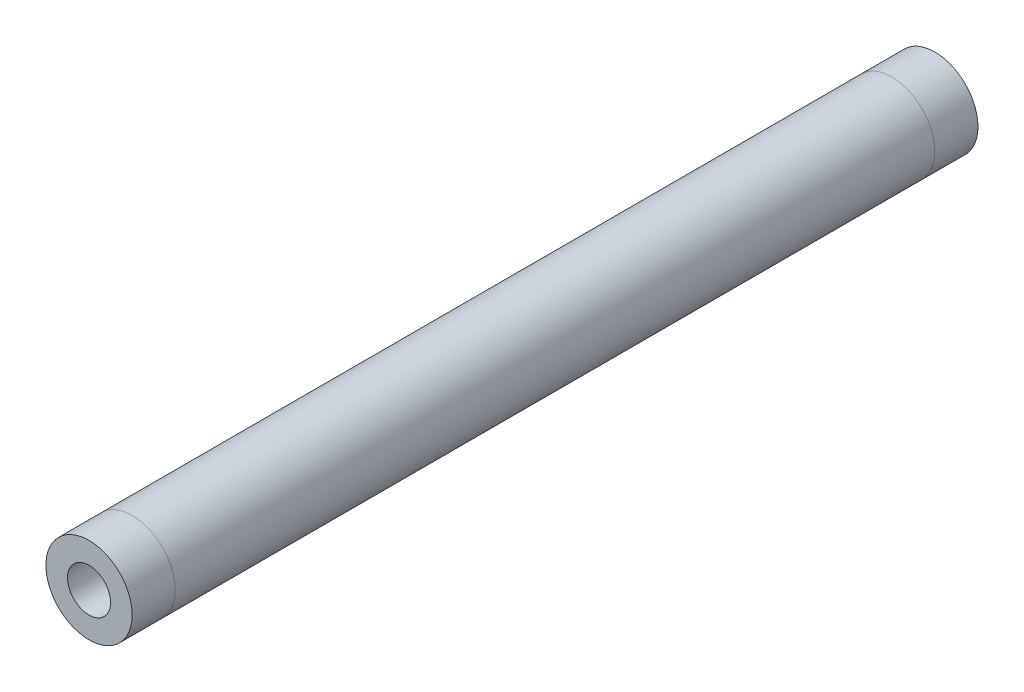
ISO-10303-21;
HEADER;
FILE_DESCRIPTION(('STEP AP214'),'2;1');
FILE_NAME('part.step','',(''),(''),'','','');
FILE_SCHEMA(('AUTOMOTIVE_DESIGN { 1 0 10303 214 1 1 1 1 }'));
ENDSEC;
DATA;
#1=APPLICATION_CONTEXT('core data for automotive mechanical design processes');
#2=APPLICATION_PROTOCOL_DEFINITION('international standard','automotive_design',2000,#1);
#3=PRODUCT_CONTEXT('',#1,'mechanical');
#4=PRODUCT('Part','Part','',(#3));
#5=PRODUCT_RELATED_PRODUCT_CATEGORY('part','',(#4));
#6=PRODUCT_DEFINITION_FORMATION('','',#4);
#7=PRODUCT_DEFINITION_CONTEXT('part definition',#1,'design');
#8=PRODUCT_DEFINITION('design','',#6,#7);
#9=PRODUCT_DEFINITION_SHAPE('','',#8);
#10=(LENGTH_UNIT() NAMED_UNIT(*) SI_UNIT(.MILLI.,.METRE.));
#11=(NAMED_UNIT(*) PLANE_ANGLE_UNIT() SI_UNIT($,.RADIAN.));
#12=(NAMED_UNIT(*) SI_UNIT($,.STERADIAN.) SOLID_ANGLE_UNIT());
#13=UNCERTAINTY_MEASURE_WITH_UNIT(LENGTH_MEASURE(1.E-05),#10,'distance_accuracy_value','');
#14=(GEOMETRIC_REPRESENTATION_CONTEXT(3) GLOBAL_UNCERTAINTY_ASSIGNED_CONTEXT((#13)) GLOBAL_UNIT_ASSIGNED_CONTEXT((#10,
#11,#12)) REPRESENTATION_CONTEXT('',''));
#15=CARTESIAN_POINT('',(0.,0.,0.));
#16=DIRECTION('',(0.,0.,1.));
#17=DIRECTION('',(1.,0.,0.));
#18=AXIS2_PLACEMENT_3D('',#15,#16,#17);
#19=CARTESIAN_POINT('',(0.,0.,-158.111565442138));
#20=DIRECTION('',(0.,0.,1.));
#21=DIRECTION('',(1.,0.,0.));
#22=AXIS2_PLACEMENT_3D('',#19,#20,#21);
#23=CYLINDRICAL_SURFACE('',#22,6.35);
#24=CARTESIAN_POINT('',(0.,0.,-140.1510532));
#25=DIRECTION('',(0.,0.,1.));
#26=DIRECTION('',(1.,0.,0.));
#27=AXIS2_PLACEMENT_3D('',#24,#25,#26);
#28=CIRCLE('',#27,6.35);
#29=CARTESIAN_POINT('',(6.35,0.,-140.1510532));
#30=VERTEX_POINT('',#29);
#31=EDGE_CURVE('E12',#30,#30,#28,.F.);
#32=ORIENTED_EDGE('',*,*,#31,.F.);
#33=EDGE_LOOP('',(#32));
#34=FACE_BOUND('',#33,.T.);
#35=CARTESIAN_POINT('',(0.,0.,-28.2575));
#36=DIRECTION('',(0.,0.,1.));
#37=DIRECTION('',(1.,0.,0.));
#38=AXIS2_PLACEMENT_3D('',#35,#36,#37);
#39=CIRCLE('',#38,6.35);
#40=CARTESIAN_POINT('',(6.35,0.,-28.2575));
#41=VERTEX_POINT('',#40);
#42=EDGE_CURVE('E79',#41,#41,#39,.T.);
#43=ORIENTED_EDGE('',*,*,#42,.F.);
#44=EDGE_LOOP('',(#43));
#45=FACE_BOUND('',#44,.T.);
#46=ADVANCED_FACE('F68',(#34,#45),#23,.T.);
#47=CARTESIAN_POINT('',(0.,0.,-28.2575));
#48=DIRECTION('',(0.,0.,1.));
#49=DIRECTION('',(1.,0.,0.));
#50=AXIS2_PLACEMENT_3D('',#47,#48,#49);
#51=PLANE('',#50);
#52=CARTESIAN_POINT('',(0.,0.,-28.2575));
#53=DIRECTION('',(0.,0.,1.));
#54=DIRECTION('',(1.,0.,0.));
#55=AXIS2_PLACEMENT_3D('',#52,#53,#54);
#56=CIRCLE('',#55,4.7625);
#57=CARTESIAN_POINT('',(4.7625,0.,-28.2575));
#58=VERTEX_POINT('',#57);
#59=EDGE_CURVE('E81',#58,#58,#56,.T.);
#60=ORIENTED_EDGE('',*,*,#59,.F.);
#61=EDGE_LOOP('',(#60));
#62=FACE_BOUND('',#61,.T.);
#63=ORIENTED_EDGE('',*,*,#42,.T.);
#64=EDGE_LOOP('',(#63));
#65=FACE_BOUND('',#64,.T.);
#66=ADVANCED_FACE('F86',(#62,#65),#51,.T.);
#67=CARTESIAN_POINT('',(0.,0.,-158.111565442138));
#68=DIRECTION('',(0.,0.,1.));
#69=DIRECTION('',(1.,0.,0.));
#70=AXIS2_PLACEMENT_3D('',#67,#68,#69);
#71=CYLINDRICAL_SURFACE('',#70,4.7625);
#72=CARTESIAN_POINT('',(0.,0.,-140.1510532));
#73=DIRECTION('',(0.,0.,1.));
#74=DIRECTION('',(1.,0.,0.));
#75=AXIS2_PLACEMENT_3D('',#72,#73,#74);
#76=CIRCLE('',#75,4.7625);
#77=CARTESIAN_POINT('',(4.7625,0.,-140.1510532));
#78=VERTEX_POINT('',#77);
#79=EDGE_CURVE('E71',#78,#78,#76,.F.);
#80=ORIENTED_EDGE('',*,*,#79,.T.);
#81=EDGE_LOOP('',(#80));
#82=FACE_BOUND('',#81,.T.);
#83=ORIENTED_EDGE('',*,*,#59,.T.);
#84=EDGE_LOOP('',(#83));
#85=FACE_BOUND('',#84,.T.);
#86=ADVANCED_FACE('F93',(#82,#85),#71,.F.);
#87=CARTESIAN_POINT('',(0.,0.,-140.1510532));
#88=DIRECTION('',(0.,0.,1.));
#89=DIRECTION('',(1.,0.,0.));
#90=AXIS2_PLACEMENT_3D('',#87,#88,#89);
#91=PLANE('',#90);
#92=ORIENTED_EDGE('',*,*,#31,.T.);
#93=EDGE_LOOP('',(#92));
#94=FACE_BOUND('',#93,.T.);
#95=ORIENTED_EDGE('',*,*,#79,.F.);
#96=EDGE_LOOP('',(#95));
#97=FACE_BOUND('',#96,.T.);
#98=ADVANCED_FACE('F98',(#94,#97),#91,.F.);
#99=CLOSED_SHELL('',(#46,#66,#86,#98));
#100=MANIFOLD_SOLID_BREP('B2',#99);
#101=CARTESIAN_POINT('',(0.,0.,-140.1510532));
#102=DIRECTION('',(0.,0.,1.));
#103=DIRECTION('',(1.,0.,0.));
#104=AXIS2_PLACEMENT_3D('',#101,#102,#103);
#105=PLANE('',#104);
#106=CARTESIAN_POINT('',(0.,0.,-140.1510532));
#107=DIRECTION('',(0.,0.,1.));
#108=DIRECTION('',(1.,0.,0.));
#109=AXIS2_PLACEMENT_3D('',#106,#107,#108);
#110=CIRCLE('',#109,6.35);
#111=CARTESIAN_POINT('',(6.35,0.,-140.1510532));
#112=VERTEX_POINT('',#111);
#113=EDGE_CURVE('E67',#112,#112,#110,.T.);
#114=ORIENTED_EDGE('',*,*,#113,.T.);
#115=EDGE_LOOP('',(#114));
#116=FACE_BOUND('',#115,.T.);
#117=CARTESIAN_POINT('',(0.,0.,-140.1510532));
#118=DIRECTION('',(0.,0.,1.));
#119=DIRECTION('',(1.,0.,0.));
#120=AXIS2_PLACEMENT_3D('',#117,#118,#119);
#121=CIRCLE('',#120,4.7625);
#122=CARTESIAN_POINT('',(4.7625,0.,-140.1510532));
#123=VERTEX_POINT('',#122);
#124=EDGE_CURVE('E151',#123,#123,#121,.T.);
#125=ORIENTED_EDGE('',*,*,#124,.F.);
#126=EDGE_LOOP('',(#125));
#127=FACE_BOUND('',#126,.T.);
#128=ADVANCED_FACE('F137',(#116,#127),#105,.T.);
#129=CARTESIAN_POINT('',(0.,0.,-140.1510532));
#130=DIRECTION('',(0.,0.,-1.));
#131=DIRECTION('',(-1.,0.,0.));
#132=AXIS2_PLACEMENT_3D('',#129,#130,#131);
#133=CYLINDRICAL_SURFACE('',#132,6.35);
#134=ORIENTED_EDGE('',*,*,#113,.F.);
#135=EDGE_LOOP('',(#134));
#136=FACE_BOUND('',#135,.T.);
#137=CARTESIAN_POINT('',(0.,0.,-146.5010532));
#138=DIRECTION('',(0.,0.,1.));
#139=DIRECTION('',(1.,0.,0.));
#140=AXIS2_PLACEMENT_3D('',#137,#138,#139);
#141=CIRCLE('',#140,6.35);
#142=CARTESIAN_POINT('',(6.35,0.,-146.5010532));
#143=VERTEX_POINT('',#142);
#144=EDGE_CURVE('E149',#143,#143,#141,.T.);
#145=ORIENTED_EDGE('',*,*,#144,.T.);
#146=EDGE_LOOP('',(#145));
#147=FACE_BOUND('',#146,.T.);
#148=ADVANCED_FACE('F139',(#136,#147),#133,.T.);
#149=CARTESIAN_POINT('',(0.,0.,-140.1510532));
#150=DIRECTION('',(0.,0.,-1.));
#151=DIRECTION('',(-1.,0.,0.));
#152=AXIS2_PLACEMENT_3D('',#149,#150,#151);
#153=CYLINDRICAL_SURFACE('',#152,3.175);
#154=CARTESIAN_POINT('',(0.,0.,-146.5010532));
#155=DIRECTION('',(0.,0.,1.));
#156=DIRECTION('',(1.,0.,0.));
#157=AXIS2_PLACEMENT_3D('',#154,#155,#156);
#158=CIRCLE('',#157,3.175);
#159=CARTESIAN_POINT('',(3.175,0.,-146.5010532));
#160=VERTEX_POINT('',#159);
#161=EDGE_CURVE('E141',#160,#160,#158,.T.);
#162=ORIENTED_EDGE('',*,*,#161,.F.);
#163=EDGE_LOOP('',(#162));
#164=FACE_BOUND('',#163,.T.);
#165=CARTESIAN_POINT('',(0.,0.,-133.8010532));
#166=DIRECTION('',(0.,0.,1.));
#167=DIRECTION('',(1.,0.,0.));
#168=AXIS2_PLACEMENT_3D('',#165,#166,#167);
#169=CIRCLE('',#168,3.175);
#170=CARTESIAN_POINT('',(3.175,0.,-133.8010532));
#171=VERTEX_POINT('',#170);
#172=EDGE_CURVE('E161',#171,#171,#169,.T.);
#173=ORIENTED_EDGE('',*,*,#172,.T.);
#174=EDGE_LOOP('',(#173));
#175=FACE_BOUND('',#174,.T.);
#176=ADVANCED_FACE('F166',(#164,#175),#153,.F.);
#177=CARTESIAN_POINT('',(0.,0.,-146.5010532));
#178=DIRECTION('',(0.,0.,1.));
#179=DIRECTION('',(1.,0.,0.));
#180=AXIS2_PLACEMENT_3D('',#177,#178,#179);
#181=PLANE('',#180);
#182=ORIENTED_EDGE('',*,*,#144,.F.);
#183=EDGE_LOOP('',(#182));
#184=FACE_BOUND('',#183,.T.);
#185=ORIENTED_EDGE('',*,*,#161,.T.);
#186=EDGE_LOOP('',(#185));
#187=FACE_BOUND('',#186,.T.);
#188=ADVANCED_FACE('F171',(#184,#187),#181,.F.);
#189=CARTESIAN_POINT('',(0.,0.,-133.8010532));
#190=DIRECTION('',(0.,0.,1.));
#191=DIRECTION('',(1.,0.,0.));
#192=AXIS2_PLACEMENT_3D('',#189,#190,#191);
#193=PLANE('',#192);
#194=CARTESIAN_POINT('',(0.,0.,-133.8010532));
#195=DIRECTION('',(0.,0.,1.));
#196=DIRECTION('',(1.,0.,0.));
#197=AXIS2_PLACEMENT_3D('',#194,#195,#196);
#198=CIRCLE('',#197,4.7625);
#199=CARTESIAN_POINT('',(4.7625,0.,-133.8010532));
#200=VERTEX_POINT('',#199);
#201=EDGE_CURVE('E154',#200,#200,#198,.T.);
#202=ORIENTED_EDGE('',*,*,#201,.T.);
#203=EDGE_LOOP('',(#202));
#204=FACE_BOUND('',#203,.T.);
#205=ORIENTED_EDGE('',*,*,#172,.F.);
#206=EDGE_LOOP('',(#205));
#207=FACE_BOUND('',#206,.T.);
#208=ADVANCED_FACE('F168',(#204,#207),#193,.T.);
#209=CARTESIAN_POINT('',(0.,0.,-133.8010532));
#210=DIRECTION('',(0.,0.,-1.));
#211=DIRECTION('',(-1.,0.,0.));
#212=AXIS2_PLACEMENT_3D('',#209,#210,#211);
#213=CYLINDRICAL_SURFACE('',#212,4.7625);
#214=ORIENTED_EDGE('',*,*,#201,.F.);
#215=EDGE_LOOP('',(#214));
#216=FACE_BOUND('',#215,.T.);
#217=ORIENTED_EDGE('',*,*,#124,.T.);
#218=EDGE_LOOP('',(#217));
#219=FACE_BOUND('',#218,.T.);
#220=ADVANCED_FACE('F170',(#216,#219),#213,.T.);
#221=CLOSED_SHELL('',(#128,#148,#176,#188,#208,#220));
#222=MANIFOLD_SOLID_BREP('B7',#221);
#223=CARTESIAN_POINT('',(0.,0.,-28.2575));
#224=DIRECTION('',(0.,0.,1.));
#225=DIRECTION('',(1.,0.,0.));
#226=AXIS2_PLACEMENT_3D('',#223,#224,#225);
#227=CYLINDRICAL_SURFACE('',#226,6.35);
#228=CARTESIAN_POINT('',(0.,0.,-28.2575));
#229=DIRECTION('',(0.,0.,1.));
#230=DIRECTION('',(1.,0.,0.));
#231=AXIS2_PLACEMENT_3D('',#228,#229,#230);
#232=CIRCLE('',#231,6.35);
#233=CARTESIAN_POINT('',(6.35,0.,-28.2575));
#234=VERTEX_POINT('',#233);
#235=EDGE_CURVE('E136',#234,#234,#232,.T.);
#236=ORIENTED_EDGE('',*,*,#235,.T.);
#237=EDGE_LOOP('',(#236));
#238=FACE_BOUND('',#237,.T.);
#239=CARTESIAN_POINT('',(0.,0.,-21.9075));
#240=DIRECTION('',(0.,0.,1.));
#241=DIRECTION('',(1.,0.,0.));
#242=AXIS2_PLACEMENT_3D('',#239,#240,#241);
#243=CIRCLE('',#242,6.35);
#244=CARTESIAN_POINT('',(6.35,0.,-21.9075));
#245=VERTEX_POINT('',#244);
#246=EDGE_CURVE('E249',#245,#245,#243,.T.);
#247=ORIENTED_EDGE('',*,*,#246,.F.);
#248=EDGE_LOOP('',(#247));
#249=FACE_BOUND('',#248,.T.);
#250=ADVANCED_FACE('F238',(#238,#249),#227,.T.);
#251=CARTESIAN_POINT('',(0.,0.,-28.2575));
#252=DIRECTION('',(0.,0.,1.));
#253=DIRECTION('',(1.,0.,0.));
#254=AXIS2_PLACEMENT_3D('',#251,#252,#253);
#255=CYLINDRICAL_SURFACE('',#254,3.175);
#256=CARTESIAN_POINT('',(0.,0.,-21.9075));
#257=DIRECTION('',(0.,0.,1.));
#258=DIRECTION('',(1.,0.,0.));
#259=AXIS2_PLACEMENT_3D('',#256,#257,#258);
#260=CIRCLE('',#259,3.175);
#261=CARTESIAN_POINT('',(3.175,0.,-21.9075));
#262=VERTEX_POINT('',#261);
#263=EDGE_CURVE('E241',#262,#262,#260,.T.);
#264=ORIENTED_EDGE('',*,*,#263,.T.);
#265=EDGE_LOOP('',(#264));
#266=FACE_BOUND('',#265,.T.);
#267=CARTESIAN_POINT('',(0.,0.,-34.6075));
#268=DIRECTION('',(0.,0.,1.));
#269=DIRECTION('',(1.,0.,0.));
#270=AXIS2_PLACEMENT_3D('',#267,#268,#269);
#271=CIRCLE('',#270,3.175);
#272=CARTESIAN_POINT('',(3.175,0.,-34.6075));
#273=VERTEX_POINT('',#272);
#274=EDGE_CURVE('E261',#273,#273,#271,.T.);
#275=ORIENTED_EDGE('',*,*,#274,.F.);
#276=EDGE_LOOP('',(#275));
#277=FACE_BOUND('',#276,.T.);
#278=ADVANCED_FACE('F269',(#266,#277),#255,.F.);
#279=CARTESIAN_POINT('',(0.,0.,-28.2575));
#280=DIRECTION('',(0.,0.,1.));
#281=DIRECTION('',(1.,0.,0.));
#282=AXIS2_PLACEMENT_3D('',#279,#280,#281);
#283=PLANE('',#282);
#284=CARTESIAN_POINT('',(0.,0.,-28.2575));
#285=DIRECTION('',(0.,0.,1.));
#286=DIRECTION('',(1.,0.,0.));
#287=AXIS2_PLACEMENT_3D('',#284,#285,#286);
#288=CIRCLE('',#287,4.7625);
#289=CARTESIAN_POINT('',(4.7625,0.,-28.2575));
#290=VERTEX_POINT('',#289);
#291=EDGE_CURVE('E251',#290,#290,#288,.T.);
#292=ORIENTED_EDGE('',*,*,#291,.T.);
#293=EDGE_LOOP('',(#292));
#294=FACE_BOUND('',#293,.T.);
#295=ORIENTED_EDGE('',*,*,#235,.F.);
#296=EDGE_LOOP('',(#295));
#297=FACE_BOUND('',#296,.T.);
#298=ADVANCED_FACE('F271',(#294,#297),#283,.F.);
#299=CARTESIAN_POINT('',(0.,0.,-21.9075));
#300=DIRECTION('',(0.,0.,1.));
#301=DIRECTION('',(1.,0.,0.));
#302=AXIS2_PLACEMENT_3D('',#299,#300,#301);
#303=PLANE('',#302);
#304=ORIENTED_EDGE('',*,*,#246,.T.);
#305=EDGE_LOOP('',(#304));
#306=FACE_BOUND('',#305,.T.);
#307=ORIENTED_EDGE('',*,*,#263,.F.);
#308=EDGE_LOOP('',(#307));
#309=FACE_BOUND('',#308,.T.);
#310=ADVANCED_FACE('F277',(#306,#309),#303,.T.);
#311=CARTESIAN_POINT('',(0.,0.,-34.6075));
#312=DIRECTION('',(0.,0.,1.));
#313=DIRECTION('',(1.,0.,0.));
#314=AXIS2_PLACEMENT_3D('',#311,#312,#313);
#315=CYLINDRICAL_SURFACE('',#314,4.7625);
#316=CARTESIAN_POINT('',(0.,0.,-34.6075));
#317=DIRECTION('',(0.,0.,1.));
#318=DIRECTION('',(1.,0.,0.));
#319=AXIS2_PLACEMENT_3D('',#316,#317,#318);
#320=CIRCLE('',#319,4.7625);
#321=CARTESIAN_POINT('',(4.7625,0.,-34.6075));
#322=VERTEX_POINT('',#321);
#323=EDGE_CURVE('E254',#322,#322,#320,.T.);
#324=ORIENTED_EDGE('',*,*,#323,.T.);
#325=EDGE_LOOP('',(#324));
#326=FACE_BOUND('',#325,.T.);
#327=ORIENTED_EDGE('',*,*,#291,.F.);
#328=EDGE_LOOP('',(#327));
#329=FACE_BOUND('',#328,.T.);
#330=ADVANCED_FACE('F282',(#326,#329),#315,.T.);
#331=CARTESIAN_POINT('',(0.,0.,-34.6075));
#332=DIRECTION('',(0.,0.,1.));
#333=DIRECTION('',(1.,0.,0.));
#334=AXIS2_PLACEMENT_3D('',#331,#332,#333);
#335=PLANE('',#334);
#336=ORIENTED_EDGE('',*,*,#274,.T.);
#337=EDGE_LOOP('',(#336));
#338=FACE_BOUND('',#337,.T.);
#339=ORIENTED_EDGE('',*,*,#323,.F.);
#340=EDGE_LOOP('',(#339));
#341=FACE_BOUND('',#340,.T.);
#342=ADVANCED_FACE('F266',(#338,#341),#335,.F.);
#343=CLOSED_SHELL('',(#250,#278,#298,#310,#330,#342));
#344=MANIFOLD_SOLID_BREP('B62',#343);
#345=ADVANCED_BREP_SHAPE_REPRESENTATION('',(#18,#100,#222,#344),#14);
#346=SHAPE_DEFINITION_REPRESENTATION(#9,#345);
ENDSEC;
END-ISO-10303-21;
